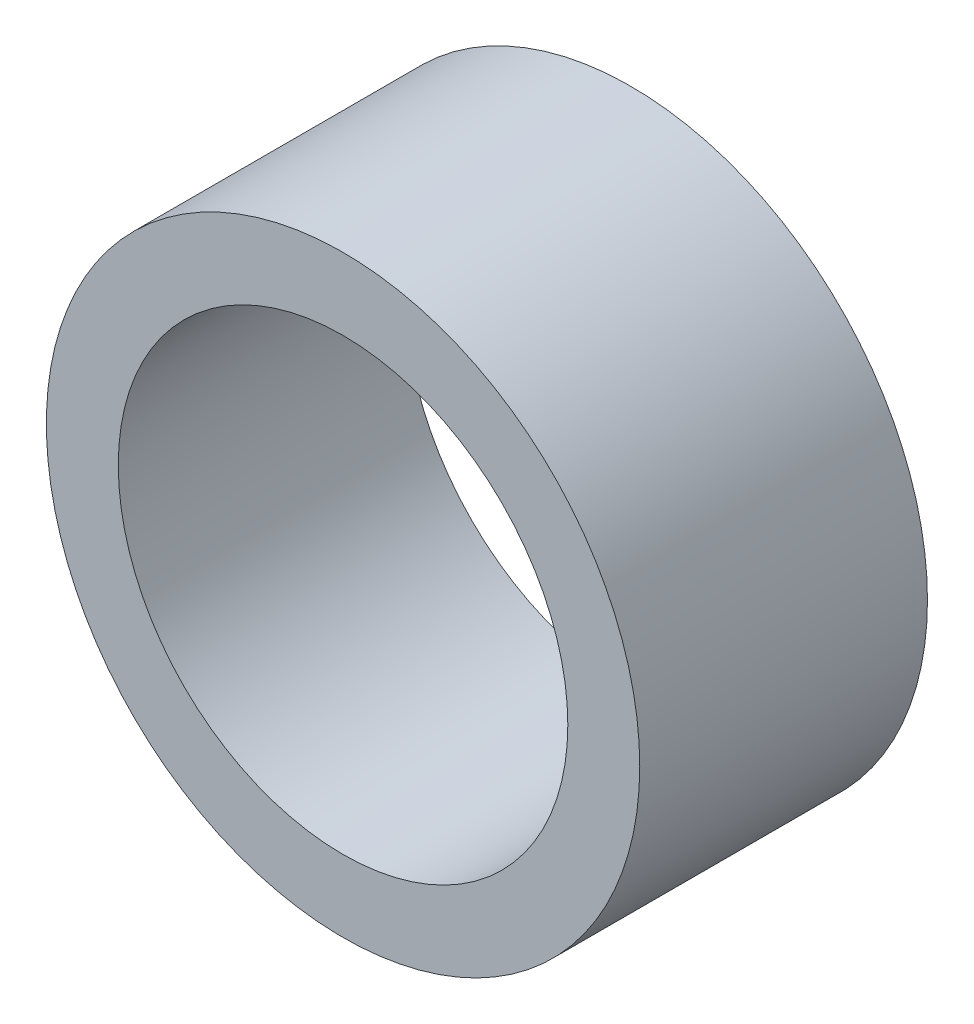
ISO-10303-21;
HEADER;
FILE_DESCRIPTION(('STEP AP214'),'2;1');
FILE_NAME('part.step','',(''),(''),'','','');
FILE_SCHEMA(('AUTOMOTIVE_DESIGN { 1 0 10303 214 1 1 1 1 }'));
ENDSEC;
DATA;
#1=APPLICATION_CONTEXT('core data for automotive mechanical design processes');
#2=APPLICATION_PROTOCOL_DEFINITION('international standard','automotive_design',2000,#1);
#3=PRODUCT_CONTEXT('',#1,'mechanical');
#4=PRODUCT('Part','Part','',(#3));
#5=PRODUCT_RELATED_PRODUCT_CATEGORY('part','',(#4));
#6=PRODUCT_DEFINITION_FORMATION('','',#4);
#7=PRODUCT_DEFINITION_CONTEXT('part definition',#1,'design');
#8=PRODUCT_DEFINITION('design','',#6,#7);
#9=PRODUCT_DEFINITION_SHAPE('','',#8);
#10=(LENGTH_UNIT() NAMED_UNIT(*) SI_UNIT(.MILLI.,.METRE.));
#11=(NAMED_UNIT(*) PLANE_ANGLE_UNIT() SI_UNIT($,.RADIAN.));
#12=(NAMED_UNIT(*) SI_UNIT($,.STERADIAN.) SOLID_ANGLE_UNIT());
#13=UNCERTAINTY_MEASURE_WITH_UNIT(LENGTH_MEASURE(1.E-05),#10,'distance_accuracy_value','');
#14=(GEOMETRIC_REPRESENTATION_CONTEXT(3) GLOBAL_UNCERTAINTY_ASSIGNED_CONTEXT((#13)) GLOBAL_UNIT_ASSIGNED_CONTEXT((#10,
#11,#12)) REPRESENTATION_CONTEXT('',''));
#15=CARTESIAN_POINT('',(0.,0.,0.));
#16=DIRECTION('',(0.,0.,1.));
#17=DIRECTION('',(1.,0.,0.));
#18=AXIS2_PLACEMENT_3D('',#15,#16,#17);
#19=CARTESIAN_POINT('',(0.,0.,16.));
#20=DIRECTION('',(0.,0.,1.));
#21=DIRECTION('',(1.,0.,0.));
#22=AXIS2_PLACEMENT_3D('',#19,#20,#21);
#23=PLANE('',#22);
#24=CARTESIAN_POINT('',(0.,0.,16.));
#25=DIRECTION('',(0.,0.,1.));
#26=DIRECTION('',(1.,0.,0.));
#27=AXIS2_PLACEMENT_3D('',#24,#25,#26);
#28=CIRCLE('',#27,16.5);
#29=CARTESIAN_POINT('',(16.5,0.,16.));
#30=VERTEX_POINT('',#29);
#31=EDGE_CURVE('E10',#30,#30,#28,.T.);
#32=ORIENTED_EDGE('',*,*,#31,.T.);
#33=EDGE_LOOP('',(#32));
#34=FACE_BOUND('',#33,.T.);
#35=CARTESIAN_POINT('',(0.,0.,16.));
#36=DIRECTION('',(0.,0.,1.));
#37=DIRECTION('',(1.,0.,0.));
#38=AXIS2_PLACEMENT_3D('',#35,#36,#37);
#39=CIRCLE('',#38,12.5);
#40=CARTESIAN_POINT('',(12.5,0.,16.));
#41=VERTEX_POINT('',#40);
#42=EDGE_CURVE('E57',#41,#41,#39,.T.);
#43=ORIENTED_EDGE('',*,*,#42,.F.);
#44=EDGE_LOOP('',(#43));
#45=FACE_BOUND('',#44,.T.);
#46=ADVANCED_FACE('F43',(#34,#45),#23,.T.);
#47=CARTESIAN_POINT('',(0.,0.,0.));
#48=DIRECTION('',(0.,0.,1.));
#49=DIRECTION('',(1.,0.,0.));
#50=AXIS2_PLACEMENT_3D('',#47,#48,#49);
#51=PLANE('',#50);
#52=CARTESIAN_POINT('',(0.,0.,0.));
#53=DIRECTION('',(0.,0.,1.));
#54=DIRECTION('',(1.,0.,0.));
#55=AXIS2_PLACEMENT_3D('',#52,#53,#54);
#56=CIRCLE('',#55,16.5);
#57=CARTESIAN_POINT('',(16.5,0.,0.));
#58=VERTEX_POINT('',#57);
#59=EDGE_CURVE('E50',#58,#58,#56,.T.);
#60=ORIENTED_EDGE('',*,*,#59,.F.);
#61=EDGE_LOOP('',(#60));
#62=FACE_BOUND('',#61,.T.);
#63=CARTESIAN_POINT('',(0.,0.,0.));
#64=DIRECTION('',(0.,0.,1.));
#65=DIRECTION('',(1.,0.,0.));
#66=AXIS2_PLACEMENT_3D('',#63,#64,#65);
#67=CIRCLE('',#66,12.5);
#68=CARTESIAN_POINT('',(12.5,0.,0.));
#69=VERTEX_POINT('',#68);
#70=EDGE_CURVE('E59',#69,#69,#67,.T.);
#71=ORIENTED_EDGE('',*,*,#70,.T.);
#72=EDGE_LOOP('',(#71));
#73=FACE_BOUND('',#72,.T.);
#74=ADVANCED_FACE('F68',(#62,#73),#51,.F.);
#75=CARTESIAN_POINT('',(0.,0.,16.));
#76=DIRECTION('',(0.,0.,-1.));
#77=DIRECTION('',(-1.,0.,0.));
#78=AXIS2_PLACEMENT_3D('',#75,#76,#77);
#79=CYLINDRICAL_SURFACE('',#78,16.5);
#80=ORIENTED_EDGE('',*,*,#31,.F.);
#81=EDGE_LOOP('',(#80));
#82=FACE_BOUND('',#81,.T.);
#83=ORIENTED_EDGE('',*,*,#59,.T.);
#84=EDGE_LOOP('',(#83));
#85=FACE_BOUND('',#84,.T.);
#86=ADVANCED_FACE('F44',(#82,#85),#79,.T.);
#87=CARTESIAN_POINT('',(0.,0.,16.));
#88=DIRECTION('',(0.,0.,-1.));
#89=DIRECTION('',(-1.,0.,0.));
#90=AXIS2_PLACEMENT_3D('',#87,#88,#89);
#91=CYLINDRICAL_SURFACE('',#90,12.5);
#92=ORIENTED_EDGE('',*,*,#42,.T.);
#93=EDGE_LOOP('',(#92));
#94=FACE_BOUND('',#93,.T.);
#95=ORIENTED_EDGE('',*,*,#70,.F.);
#96=EDGE_LOOP('',(#95));
#97=FACE_BOUND('',#96,.T.);
#98=ADVANCED_FACE('F67',(#94,#97),#91,.F.);
#99=CLOSED_SHELL('',(#46,#74,#86,#98));
#100=MANIFOLD_SOLID_BREP('B2',#99);
#101=ADVANCED_BREP_SHAPE_REPRESENTATION('',(#18,#100),#14);
#102=SHAPE_DEFINITION_REPRESENTATION(#9,#101);
ENDSEC;
END-ISO-10303-21;
